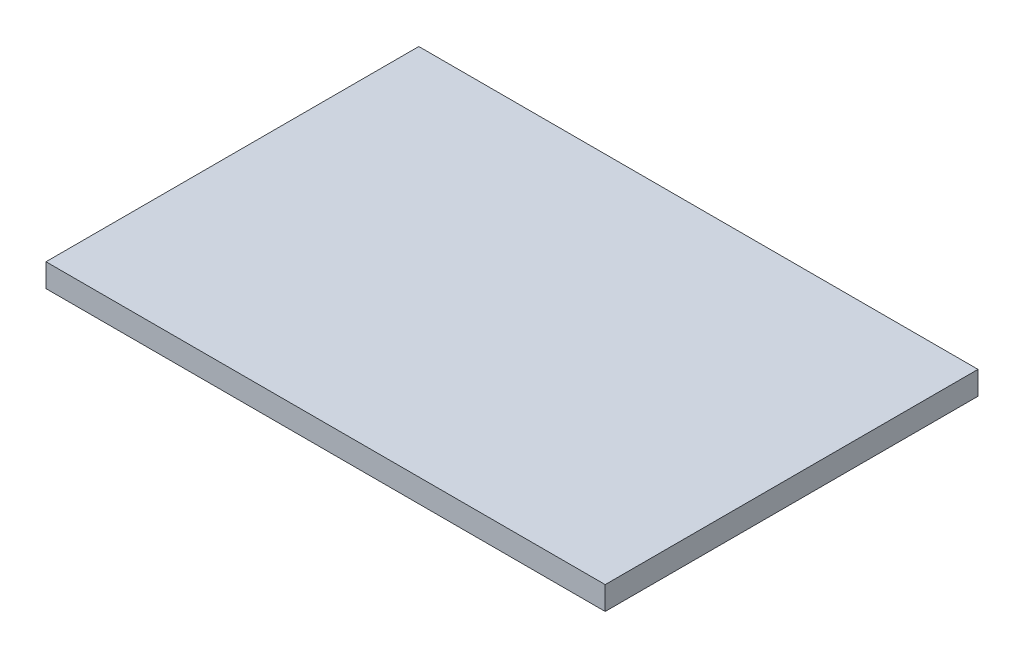
ISO-10303-21;
HEADER;
FILE_DESCRIPTION(('STEP AP214'),'2;1');
FILE_NAME('part.step','',(''),(''),'','','');
FILE_SCHEMA(('AUTOMOTIVE_DESIGN { 1 0 10303 214 1 1 1 1 }'));
ENDSEC;
DATA;
#1=APPLICATION_CONTEXT('core data for automotive mechanical design processes');
#2=APPLICATION_PROTOCOL_DEFINITION('international standard','automotive_design',2000,#1);
#3=PRODUCT_CONTEXT('',#1,'mechanical');
#4=PRODUCT('Part','Part','',(#3));
#5=PRODUCT_RELATED_PRODUCT_CATEGORY('part','',(#4));
#6=PRODUCT_DEFINITION_FORMATION('','',#4);
#7=PRODUCT_DEFINITION_CONTEXT('part definition',#1,'design');
#8=PRODUCT_DEFINITION('design','',#6,#7);
#9=PRODUCT_DEFINITION_SHAPE('','',#8);
#10=(LENGTH_UNIT() NAMED_UNIT(*) SI_UNIT(.MILLI.,.METRE.));
#11=(NAMED_UNIT(*) PLANE_ANGLE_UNIT() SI_UNIT($,.RADIAN.));
#12=(NAMED_UNIT(*) SI_UNIT($,.STERADIAN.) SOLID_ANGLE_UNIT());
#13=UNCERTAINTY_MEASURE_WITH_UNIT(LENGTH_MEASURE(1.E-05),#10,'distance_accuracy_value','');
#14=(GEOMETRIC_REPRESENTATION_CONTEXT(3) GLOBAL_UNCERTAINTY_ASSIGNED_CONTEXT((#13)) GLOBAL_UNIT_ASSIGNED_CONTEXT((#10,
#11,#12)) REPRESENTATION_CONTEXT('',''));
#15=CARTESIAN_POINT('',(0.,0.,0.));
#16=DIRECTION('',(0.,0.,1.));
#17=DIRECTION('',(1.,0.,0.));
#18=AXIS2_PLACEMENT_3D('',#15,#16,#17);
#19=CARTESIAN_POINT('',(-228.6,19.05,-152.4));
#20=DIRECTION('',(1.,0.,0.));
#21=DIRECTION('',(0.,0.,-1.));
#22=AXIS2_PLACEMENT_3D('',#19,#20,#21);
#23=PLANE('',#22);
#24=DIRECTION('',(0.,0.,1.));
#25=VECTOR('',#24,1.);
#26=CARTESIAN_POINT('',(-228.6,0.,-152.4));
#27=LINE('',#26,#25);
#28=CARTESIAN_POINT('',(-228.6,0.,-152.4));
#29=VERTEX_POINT('',#28);
#30=CARTESIAN_POINT('',(-228.6,0.,152.4));
#31=VERTEX_POINT('',#30);
#32=EDGE_CURVE('E96',#29,#31,#27,.T.);
#33=ORIENTED_EDGE('',*,*,#32,.T.);
#34=DIRECTION('',(0.,-1.,0.));
#35=VECTOR('',#34,1.);
#36=CARTESIAN_POINT('',(-228.6,19.05,152.4));
#37=LINE('',#36,#35);
#38=CARTESIAN_POINT('',(-228.6,19.05,152.4));
#39=VERTEX_POINT('',#38);
#40=EDGE_CURVE('E11',#39,#31,#37,.T.);
#41=ORIENTED_EDGE('',*,*,#40,.F.);
#42=DIRECTION('',(0.,0.,1.));
#43=VECTOR('',#42,1.);
#44=CARTESIAN_POINT('',(-228.6,19.05,-152.4));
#45=LINE('',#44,#43);
#46=CARTESIAN_POINT('',(-228.6,19.05,-152.4));
#47=VERTEX_POINT('',#46);
#48=EDGE_CURVE('E84',#47,#39,#45,.T.);
#49=ORIENTED_EDGE('',*,*,#48,.F.);
#50=DIRECTION('',(0.,-1.,0.));
#51=VECTOR('',#50,1.);
#52=CARTESIAN_POINT('',(-228.6,19.05,-152.4));
#53=LINE('',#52,#51);
#54=EDGE_CURVE('E92',#47,#29,#53,.T.);
#55=ORIENTED_EDGE('',*,*,#54,.T.);
#56=EDGE_LOOP('',(#33,#41,#49,#55));
#57=FACE_BOUND('',#56,.T.);
#58=ADVANCED_FACE('F33',(#57),#23,.F.);
#59=CARTESIAN_POINT('',(-228.6,19.05,152.4));
#60=DIRECTION('',(0.,0.,-1.));
#61=DIRECTION('',(-1.,0.,0.));
#62=AXIS2_PLACEMENT_3D('',#59,#60,#61);
#63=PLANE('',#62);
#64=DIRECTION('',(1.,0.,0.));
#65=VECTOR('',#64,1.);
#66=CARTESIAN_POINT('',(-228.6,0.,152.4));
#67=LINE('',#66,#65);
#68=CARTESIAN_POINT('',(228.6,0.,152.4));
#69=VERTEX_POINT('',#68);
#70=EDGE_CURVE('E88',#31,#69,#67,.T.);
#71=ORIENTED_EDGE('',*,*,#70,.T.);
#72=DIRECTION('',(0.,-1.,0.));
#73=VECTOR('',#72,1.);
#74=CARTESIAN_POINT('',(228.6,19.05,152.4));
#75=LINE('',#74,#73);
#76=CARTESIAN_POINT('',(228.6,19.05,152.4));
#77=VERTEX_POINT('',#76);
#78=EDGE_CURVE('E41',#77,#69,#75,.T.);
#79=ORIENTED_EDGE('',*,*,#78,.F.);
#80=DIRECTION('',(1.,0.,0.));
#81=VECTOR('',#80,1.);
#82=CARTESIAN_POINT('',(-228.6,19.05,152.4));
#83=LINE('',#82,#81);
#84=EDGE_CURVE('E79',#39,#77,#83,.T.);
#85=ORIENTED_EDGE('',*,*,#84,.F.);
#86=ORIENTED_EDGE('',*,*,#40,.T.);
#87=EDGE_LOOP('',(#71,#79,#85,#86));
#88=FACE_BOUND('',#87,.T.);
#89=ADVANCED_FACE('F87',(#88),#63,.F.);
#90=CARTESIAN_POINT('',(228.6,19.05,-152.4));
#91=DIRECTION('',(-1.,0.,0.));
#92=DIRECTION('',(0.,0.,1.));
#93=AXIS2_PLACEMENT_3D('',#90,#91,#92);
#94=PLANE('',#93);
#95=DIRECTION('',(0.,0.,-1.));
#96=VECTOR('',#95,1.);
#97=CARTESIAN_POINT('',(228.6,0.,-152.4));
#98=LINE('',#97,#96);
#99=CARTESIAN_POINT('',(228.6,0.,-152.4));
#100=VERTEX_POINT('',#99);
#101=EDGE_CURVE('E66',#69,#100,#98,.T.);
#102=ORIENTED_EDGE('',*,*,#101,.T.);
#103=DIRECTION('',(0.,-1.,0.));
#104=VECTOR('',#103,1.);
#105=CARTESIAN_POINT('',(228.6,19.05,-152.4));
#106=LINE('',#105,#104);
#107=CARTESIAN_POINT('',(228.6,19.05,-152.4));
#108=VERTEX_POINT('',#107);
#109=EDGE_CURVE('E89',#108,#100,#106,.T.);
#110=ORIENTED_EDGE('',*,*,#109,.F.);
#111=DIRECTION('',(0.,0.,-1.));
#112=VECTOR('',#111,1.);
#113=CARTESIAN_POINT('',(228.6,19.05,-152.4));
#114=LINE('',#113,#112);
#115=EDGE_CURVE('E82',#77,#108,#114,.T.);
#116=ORIENTED_EDGE('',*,*,#115,.F.);
#117=ORIENTED_EDGE('',*,*,#78,.T.);
#118=EDGE_LOOP('',(#102,#110,#116,#117));
#119=FACE_BOUND('',#118,.T.);
#120=ADVANCED_FACE('F90',(#119),#94,.F.);
#121=CARTESIAN_POINT('',(-228.6,19.05,-152.4));
#122=DIRECTION('',(0.,0.,1.));
#123=DIRECTION('',(1.,0.,0.));
#124=AXIS2_PLACEMENT_3D('',#121,#122,#123);
#125=PLANE('',#124);
#126=DIRECTION('',(-1.,0.,0.));
#127=VECTOR('',#126,1.);
#128=CARTESIAN_POINT('',(-228.6,0.,-152.4));
#129=LINE('',#128,#127);
#130=EDGE_CURVE('E72',#100,#29,#129,.T.);
#131=ORIENTED_EDGE('',*,*,#130,.T.);
#132=ORIENTED_EDGE('',*,*,#54,.F.);
#133=DIRECTION('',(-1.,0.,0.));
#134=VECTOR('',#133,1.);
#135=CARTESIAN_POINT('',(-228.6,19.05,-152.4));
#136=LINE('',#135,#134);
#137=EDGE_CURVE('E49',#108,#47,#136,.T.);
#138=ORIENTED_EDGE('',*,*,#137,.F.);
#139=ORIENTED_EDGE('',*,*,#109,.T.);
#140=EDGE_LOOP('',(#131,#132,#138,#139));
#141=FACE_BOUND('',#140,.T.);
#142=ADVANCED_FACE('F103',(#141),#125,.F.);
#143=CARTESIAN_POINT('',(-228.6,19.05,152.4));
#144=DIRECTION('',(0.,1.,0.));
#145=DIRECTION('',(0.,0.,1.));
#146=AXIS2_PLACEMENT_3D('',#143,#144,#145);
#147=PLANE('',#146);
#148=ORIENTED_EDGE('',*,*,#48,.T.);
#149=ORIENTED_EDGE('',*,*,#84,.T.);
#150=ORIENTED_EDGE('',*,*,#115,.T.);
#151=ORIENTED_EDGE('',*,*,#137,.T.);
#152=EDGE_LOOP('',(#148,#149,#150,#151));
#153=FACE_BOUND('',#152,.T.);
#154=ADVANCED_FACE('F80',(#153),#147,.T.);
#155=CARTESIAN_POINT('',(-228.6,0.,152.4));
#156=DIRECTION('',(0.,1.,0.));
#157=DIRECTION('',(0.,0.,1.));
#158=AXIS2_PLACEMENT_3D('',#155,#156,#157);
#159=PLANE('',#158);
#160=ORIENTED_EDGE('',*,*,#32,.F.);
#161=ORIENTED_EDGE('',*,*,#130,.F.);
#162=ORIENTED_EDGE('',*,*,#101,.F.);
#163=ORIENTED_EDGE('',*,*,#70,.F.);
#164=EDGE_LOOP('',(#160,#161,#162,#163));
#165=FACE_BOUND('',#164,.T.);
#166=ADVANCED_FACE('F106',(#165),#159,.F.);
#167=CLOSED_SHELL('',(#58,#89,#120,#142,#154,#166));
#168=MANIFOLD_SOLID_BREP('B2',#167);
#169=ADVANCED_BREP_SHAPE_REPRESENTATION('',(#18,#168),#14);
#170=SHAPE_DEFINITION_REPRESENTATION(#9,#169);
ENDSEC;
END-ISO-10303-21;
